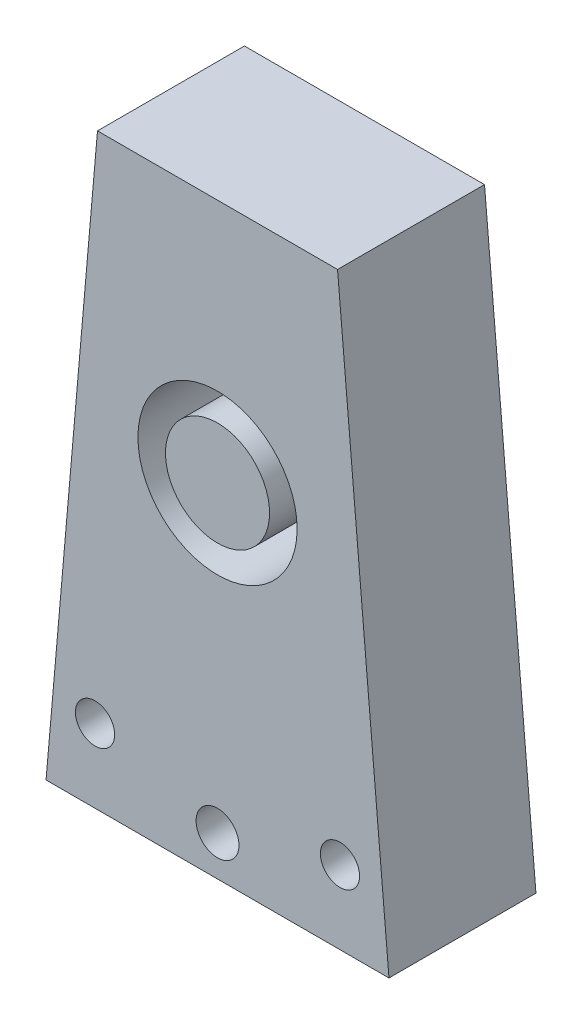
ISO-10303-21;
HEADER;
FILE_DESCRIPTION(('STEP AP214'),'2;1');
FILE_NAME('part.step','',(''),(''),'','','');
FILE_SCHEMA(('AUTOMOTIVE_DESIGN { 1 0 10303 214 1 1 1 1 }'));
ENDSEC;
DATA;
#1=APPLICATION_CONTEXT('core data for automotive mechanical design processes');
#2=APPLICATION_PROTOCOL_DEFINITION('international standard','automotive_design',2000,#1);
#3=PRODUCT_CONTEXT('',#1,'mechanical');
#4=PRODUCT('Part','Part','',(#3));
#5=PRODUCT_RELATED_PRODUCT_CATEGORY('part','',(#4));
#6=PRODUCT_DEFINITION_FORMATION('','',#4);
#7=PRODUCT_DEFINITION_CONTEXT('part definition',#1,'design');
#8=PRODUCT_DEFINITION('design','',#6,#7);
#9=PRODUCT_DEFINITION_SHAPE('','',#8);
#10=(LENGTH_UNIT() NAMED_UNIT(*) SI_UNIT(.MILLI.,.METRE.));
#11=(NAMED_UNIT(*) PLANE_ANGLE_UNIT() SI_UNIT($,.RADIAN.));
#12=(NAMED_UNIT(*) SI_UNIT($,.STERADIAN.) SOLID_ANGLE_UNIT());
#13=UNCERTAINTY_MEASURE_WITH_UNIT(LENGTH_MEASURE(1.E-05),#10,'distance_accuracy_value','');
#14=(GEOMETRIC_REPRESENTATION_CONTEXT(3) GLOBAL_UNCERTAINTY_ASSIGNED_CONTEXT((#13)) GLOBAL_UNIT_ASSIGNED_CONTEXT((#10,
#11,#12)) REPRESENTATION_CONTEXT('',''));
#15=CARTESIAN_POINT('',(0.,0.,0.));
#16=DIRECTION('',(0.,0.,1.));
#17=DIRECTION('',(1.,0.,0.));
#18=AXIS2_PLACEMENT_3D('',#15,#16,#17);
#19=CARTESIAN_POINT('',(-9.8,48.,12.));
#20=DIRECTION('',(0.996193717496113,-0.0871669502809099,0.));
#21=DIRECTION('',(0.0871669502809099,0.996193717496113,0.));
#22=AXIS2_PLACEMENT_3D('',#19,#20,#21);
#23=PLANE('',#22);
#24=DIRECTION('',(-0.0871669502809099,-0.996193717496113,0.));
#25=VECTOR('',#24,1.);
#26=CARTESIAN_POINT('',(-9.8,48.,0.));
#27=LINE('',#26,#25);
#28=CARTESIAN_POINT('',(-9.8,48.,0.));
#29=VERTEX_POINT('',#28);
#30=CARTESIAN_POINT('',(-14.,0.,0.));
#31=VERTEX_POINT('',#30);
#32=EDGE_CURVE('E130',#29,#31,#27,.T.);
#33=ORIENTED_EDGE('',*,*,#32,.T.);
#34=DIRECTION('',(0.,0.,-1.));
#35=VECTOR('',#34,1.);
#36=CARTESIAN_POINT('',(-14.,0.,12.));
#37=LINE('',#36,#35);
#38=CARTESIAN_POINT('',(-14.,0.,12.));
#39=VERTEX_POINT('',#38);
#40=EDGE_CURVE('E109',#39,#31,#37,.T.);
#41=ORIENTED_EDGE('',*,*,#40,.F.);
#42=DIRECTION('',(-0.0871669502809099,-0.996193717496113,0.));
#43=VECTOR('',#42,1.);
#44=CARTESIAN_POINT('',(-9.8,48.,12.));
#45=LINE('',#44,#43);
#46=CARTESIAN_POINT('',(-9.8,48.,12.));
#47=VERTEX_POINT('',#46);
#48=EDGE_CURVE('E136',#47,#39,#45,.T.);
#49=ORIENTED_EDGE('',*,*,#48,.F.);
#50=DIRECTION('',(0.,0.,-1.));
#51=VECTOR('',#50,1.);
#52=CARTESIAN_POINT('',(-9.8,48.,12.));
#53=LINE('',#52,#51);
#54=EDGE_CURVE('E114',#47,#29,#53,.T.);
#55=ORIENTED_EDGE('',*,*,#54,.T.);
#56=EDGE_LOOP('',(#33,#41,#49,#55));
#57=FACE_BOUND('',#56,.T.);
#58=ADVANCED_FACE('F52',(#57),#23,.F.);
#59=CARTESIAN_POINT('',(-14.,0.,12.));
#60=DIRECTION('',(0.,1.,0.));
#61=DIRECTION('',(0.,0.,1.));
#62=AXIS2_PLACEMENT_3D('',#59,#60,#61);
#63=PLANE('',#62);
#64=DIRECTION('',(1.,0.,0.));
#65=VECTOR('',#64,1.);
#66=CARTESIAN_POINT('',(-14.,0.,0.));
#67=LINE('',#66,#65);
#68=CARTESIAN_POINT('',(14.,0.,0.));
#69=VERTEX_POINT('',#68);
#70=EDGE_CURVE('E71',#31,#69,#67,.T.);
#71=ORIENTED_EDGE('',*,*,#70,.T.);
#72=DIRECTION('',(0.,0.,-1.));
#73=VECTOR('',#72,1.);
#74=CARTESIAN_POINT('',(14.,0.,12.));
#75=LINE('',#74,#73);
#76=CARTESIAN_POINT('',(14.,0.,12.));
#77=VERTEX_POINT('',#76);
#78=EDGE_CURVE('E110',#77,#69,#75,.T.);
#79=ORIENTED_EDGE('',*,*,#78,.F.);
#80=DIRECTION('',(1.,0.,0.));
#81=VECTOR('',#80,1.);
#82=CARTESIAN_POINT('',(-14.,0.,12.));
#83=LINE('',#82,#81);
#84=EDGE_CURVE('E90',#39,#77,#83,.T.);
#85=ORIENTED_EDGE('',*,*,#84,.F.);
#86=ORIENTED_EDGE('',*,*,#40,.T.);
#87=EDGE_LOOP('',(#71,#79,#85,#86));
#88=FACE_BOUND('',#87,.T.);
#89=ADVANCED_FACE('F106',(#88),#63,.F.);
#90=CARTESIAN_POINT('',(14.,0.,12.));
#91=DIRECTION('',(-0.996193717496113,-0.0871669502809099,0.));
#92=DIRECTION('',(0.0871669502809099,-0.996193717496113,0.));
#93=AXIS2_PLACEMENT_3D('',#90,#91,#92);
#94=PLANE('',#93);
#95=DIRECTION('',(-0.0871669502809099,0.996193717496113,0.));
#96=VECTOR('',#95,1.);
#97=CARTESIAN_POINT('',(14.,0.,0.));
#98=LINE('',#97,#96);
#99=CARTESIAN_POINT('',(9.8,48.,0.));
#100=VERTEX_POINT('',#99);
#101=EDGE_CURVE('E102',#69,#100,#98,.T.);
#102=ORIENTED_EDGE('',*,*,#101,.T.);
#103=DIRECTION('',(0.,0.,-1.));
#104=VECTOR('',#103,1.);
#105=CARTESIAN_POINT('',(9.8,48.,12.));
#106=LINE('',#105,#104);
#107=CARTESIAN_POINT('',(9.8,48.,12.));
#108=VERTEX_POINT('',#107);
#109=EDGE_CURVE('E148',#108,#100,#106,.T.);
#110=ORIENTED_EDGE('',*,*,#109,.F.);
#111=DIRECTION('',(-0.0871669502809099,0.996193717496113,0.));
#112=VECTOR('',#111,1.);
#113=CARTESIAN_POINT('',(14.,0.,12.));
#114=LINE('',#113,#112);
#115=EDGE_CURVE('E117',#77,#108,#114,.T.);
#116=ORIENTED_EDGE('',*,*,#115,.F.);
#117=ORIENTED_EDGE('',*,*,#78,.T.);
#118=EDGE_LOOP('',(#102,#110,#116,#117));
#119=FACE_BOUND('',#118,.T.);
#120=ADVANCED_FACE('F113',(#119),#94,.F.);
#121=CARTESIAN_POINT('',(9.8,48.,12.));
#122=DIRECTION('',(0.,-1.,0.));
#123=DIRECTION('',(0.,0.,-1.));
#124=AXIS2_PLACEMENT_3D('',#121,#122,#123);
#125=PLANE('',#124);
#126=DIRECTION('',(-1.,0.,0.));
#127=VECTOR('',#126,1.);
#128=CARTESIAN_POINT('',(9.8,48.,0.));
#129=LINE('',#128,#127);
#130=EDGE_CURVE('E98',#100,#29,#129,.T.);
#131=ORIENTED_EDGE('',*,*,#130,.T.);
#132=ORIENTED_EDGE('',*,*,#54,.F.);
#133=DIRECTION('',(-1.,0.,0.));
#134=VECTOR('',#133,1.);
#135=CARTESIAN_POINT('',(9.8,48.,12.));
#136=LINE('',#135,#134);
#137=EDGE_CURVE('E128',#108,#47,#136,.T.);
#138=ORIENTED_EDGE('',*,*,#137,.F.);
#139=ORIENTED_EDGE('',*,*,#109,.T.);
#140=EDGE_LOOP('',(#131,#132,#138,#139));
#141=FACE_BOUND('',#140,.T.);
#142=ADVANCED_FACE('F195',(#141),#125,.F.);
#143=CARTESIAN_POINT('',(0.,0.,12.));
#144=DIRECTION('',(0.,0.,1.));
#145=DIRECTION('',(1.,0.,0.));
#146=AXIS2_PLACEMENT_3D('',#143,#144,#145);
#147=PLANE('',#146);
#148=CARTESIAN_POINT('',(10.,6.,12.));
#149=DIRECTION('',(0.,0.,1.));
#150=DIRECTION('',(1.,0.,0.));
#151=AXIS2_PLACEMENT_3D('',#148,#149,#150);
#152=CIRCLE('',#151,1.6);
#153=CARTESIAN_POINT('',(11.6,6.,12.));
#154=VERTEX_POINT('',#153);
#155=EDGE_CURVE('E143',#154,#154,#152,.F.);
#156=ORIENTED_EDGE('',*,*,#155,.T.);
#157=EDGE_LOOP('',(#156));
#158=FACE_BOUND('',#157,.T.);
#159=CARTESIAN_POINT('',(0.,28.,12.));
#160=DIRECTION('',(0.,0.,1.));
#161=DIRECTION('',(1.,0.,0.));
#162=AXIS2_PLACEMENT_3D('',#159,#160,#161);
#163=CIRCLE('',#162,6.5);
#164=CARTESIAN_POINT('',(6.5,28.,12.));
#165=VERTEX_POINT('',#164);
#166=EDGE_CURVE('E144',#165,#165,#163,.F.);
#167=ORIENTED_EDGE('',*,*,#166,.T.);
#168=EDGE_LOOP('',(#167));
#169=FACE_BOUND('',#168,.T.);
#170=CARTESIAN_POINT('',(0.,3.25,12.));
#171=DIRECTION('',(0.,0.,1.));
#172=DIRECTION('',(1.,0.,0.));
#173=AXIS2_PLACEMENT_3D('',#170,#171,#172);
#174=CIRCLE('',#173,1.75);
#175=CARTESIAN_POINT('',(1.75,3.25,12.));
#176=VERTEX_POINT('',#175);
#177=EDGE_CURVE('E147',#176,#176,#174,.F.);
#178=ORIENTED_EDGE('',*,*,#177,.T.);
#179=EDGE_LOOP('',(#178));
#180=FACE_BOUND('',#179,.T.);
#181=CARTESIAN_POINT('',(-10.,6.,12.));
#182=DIRECTION('',(0.,0.,1.));
#183=DIRECTION('',(1.,0.,0.));
#184=AXIS2_PLACEMENT_3D('',#181,#182,#183);
#185=CIRCLE('',#184,1.6);
#186=CARTESIAN_POINT('',(-8.4,6.,12.));
#187=VERTEX_POINT('',#186);
#188=EDGE_CURVE('E137',#187,#187,#185,.F.);
#189=ORIENTED_EDGE('',*,*,#188,.T.);
#190=EDGE_LOOP('',(#189));
#191=FACE_BOUND('',#190,.T.);
#192=ORIENTED_EDGE('',*,*,#48,.T.);
#193=ORIENTED_EDGE('',*,*,#84,.T.);
#194=ORIENTED_EDGE('',*,*,#115,.T.);
#195=ORIENTED_EDGE('',*,*,#137,.T.);
#196=EDGE_LOOP('',(#192,#193,#194,#195));
#197=FACE_BOUND('',#196,.T.);
#198=ADVANCED_FACE('F54',(#158,#169,#180,#191,#197),#147,.T.);
#199=CARTESIAN_POINT('',(0.,0.,0.));
#200=DIRECTION('',(0.,0.,1.));
#201=DIRECTION('',(1.,0.,0.));
#202=AXIS2_PLACEMENT_3D('',#199,#200,#201);
#203=PLANE('',#202);
#204=CARTESIAN_POINT('',(10.,6.,0.));
#205=DIRECTION('',(0.,0.,1.));
#206=DIRECTION('',(1.,0.,0.));
#207=AXIS2_PLACEMENT_3D('',#204,#205,#206);
#208=CIRCLE('',#207,1.6);
#209=CARTESIAN_POINT('',(11.6,6.,0.));
#210=VERTEX_POINT('',#209);
#211=EDGE_CURVE('E60',#210,#210,#208,.T.);
#212=ORIENTED_EDGE('',*,*,#211,.T.);
#213=EDGE_LOOP('',(#212));
#214=FACE_BOUND('',#213,.T.);
#215=CARTESIAN_POINT('',(0.,28.,0.));
#216=DIRECTION('',(0.,0.,1.));
#217=DIRECTION('',(1.,0.,0.));
#218=AXIS2_PLACEMENT_3D('',#215,#216,#217);
#219=CIRCLE('',#218,6.5);
#220=CARTESIAN_POINT('',(6.5,28.,0.));
#221=VERTEX_POINT('',#220);
#222=EDGE_CURVE('E160',#221,#221,#219,.T.);
#223=ORIENTED_EDGE('',*,*,#222,.T.);
#224=EDGE_LOOP('',(#223));
#225=FACE_BOUND('',#224,.T.);
#226=CARTESIAN_POINT('',(0.,3.25,0.));
#227=DIRECTION('',(0.,0.,1.));
#228=DIRECTION('',(1.,0.,0.));
#229=AXIS2_PLACEMENT_3D('',#226,#227,#228);
#230=CIRCLE('',#229,1.75);
#231=CARTESIAN_POINT('',(1.75,3.25,0.));
#232=VERTEX_POINT('',#231);
#233=EDGE_CURVE('E61',#232,#232,#230,.T.);
#234=ORIENTED_EDGE('',*,*,#233,.T.);
#235=EDGE_LOOP('',(#234));
#236=FACE_BOUND('',#235,.T.);
#237=CARTESIAN_POINT('',(-10.,6.,0.));
#238=DIRECTION('',(0.,0.,1.));
#239=DIRECTION('',(1.,0.,0.));
#240=AXIS2_PLACEMENT_3D('',#237,#238,#239);
#241=CIRCLE('',#240,1.6);
#242=CARTESIAN_POINT('',(-8.4,6.,0.));
#243=VERTEX_POINT('',#242);
#244=EDGE_CURVE('E12',#243,#243,#241,.T.);
#245=ORIENTED_EDGE('',*,*,#244,.T.);
#246=EDGE_LOOP('',(#245));
#247=FACE_BOUND('',#246,.T.);
#248=ORIENTED_EDGE('',*,*,#32,.F.);
#249=ORIENTED_EDGE('',*,*,#130,.F.);
#250=ORIENTED_EDGE('',*,*,#101,.F.);
#251=ORIENTED_EDGE('',*,*,#70,.F.);
#252=EDGE_LOOP('',(#248,#249,#250,#251));
#253=FACE_BOUND('',#252,.T.);
#254=ADVANCED_FACE('F116',(#214,#225,#236,#247,#253),#203,.F.);
#255=CARTESIAN_POINT('',(-10.,6.,13.));
#256=DIRECTION('',(0.,0.,-1.));
#257=DIRECTION('',(-1.,0.,0.));
#258=AXIS2_PLACEMENT_3D('',#255,#256,#257);
#259=CYLINDRICAL_SURFACE('',#258,1.6);
#260=ORIENTED_EDGE('',*,*,#188,.F.);
#261=EDGE_LOOP('',(#260));
#262=FACE_BOUND('',#261,.T.);
#263=ORIENTED_EDGE('',*,*,#244,.F.);
#264=EDGE_LOOP('',(#263));
#265=FACE_BOUND('',#264,.T.);
#266=ADVANCED_FACE('F166',(#262,#265),#259,.F.);
#267=CARTESIAN_POINT('',(0.,3.25,13.));
#268=DIRECTION('',(0.,0.,-1.));
#269=DIRECTION('',(-1.,0.,0.));
#270=AXIS2_PLACEMENT_3D('',#267,#268,#269);
#271=CYLINDRICAL_SURFACE('',#270,1.75);
#272=ORIENTED_EDGE('',*,*,#177,.F.);
#273=EDGE_LOOP('',(#272));
#274=FACE_BOUND('',#273,.T.);
#275=ORIENTED_EDGE('',*,*,#233,.F.);
#276=EDGE_LOOP('',(#275));
#277=FACE_BOUND('',#276,.T.);
#278=ADVANCED_FACE('F167',(#274,#277),#271,.F.);
#279=CARTESIAN_POINT('',(0.,28.,13.));
#280=DIRECTION('',(0.,0.,-1.));
#281=DIRECTION('',(-1.,0.,0.));
#282=AXIS2_PLACEMENT_3D('',#279,#280,#281);
#283=CYLINDRICAL_SURFACE('',#282,6.5);
#284=ORIENTED_EDGE('',*,*,#166,.F.);
#285=EDGE_LOOP('',(#284));
#286=FACE_BOUND('',#285,.T.);
#287=ORIENTED_EDGE('',*,*,#222,.F.);
#288=EDGE_LOOP('',(#287));
#289=FACE_BOUND('',#288,.T.);
#290=ADVANCED_FACE('F169',(#286,#289),#283,.F.);
#291=CARTESIAN_POINT('',(10.,6.,13.));
#292=DIRECTION('',(0.,0.,-1.));
#293=DIRECTION('',(-1.,0.,0.));
#294=AXIS2_PLACEMENT_3D('',#291,#292,#293);
#295=CYLINDRICAL_SURFACE('',#294,1.6);
#296=ORIENTED_EDGE('',*,*,#155,.F.);
#297=EDGE_LOOP('',(#296));
#298=FACE_BOUND('',#297,.T.);
#299=ORIENTED_EDGE('',*,*,#211,.F.);
#300=EDGE_LOOP('',(#299));
#301=FACE_BOUND('',#300,.T.);
#302=ADVANCED_FACE('F179',(#298,#301),#295,.F.);
#303=CLOSED_SHELL('',(#58,#89,#120,#142,#198,#254,#266,#278,#290,#302));
#304=MANIFOLD_SOLID_BREP('B2',#303);
#305=CARTESIAN_POINT('',(0.,0.,0.));
#306=DIRECTION('',(0.,0.,1.));
#307=DIRECTION('',(1.,0.,0.));
#308=AXIS2_PLACEMENT_3D('',#305,#306,#307);
#309=PLANE('',#308);
#310=CARTESIAN_POINT('',(0.,28.,0.));
#311=DIRECTION('',(0.,0.,1.));
#312=DIRECTION('',(1.,0.,0.));
#313=AXIS2_PLACEMENT_3D('',#310,#311,#312);
#314=CIRCLE('',#313,4.25);
#315=CARTESIAN_POINT('',(4.25,28.,0.));
#316=VERTEX_POINT('',#315);
#317=EDGE_CURVE('E286',#316,#316,#314,.T.);
#318=ORIENTED_EDGE('',*,*,#317,.F.);
#319=EDGE_LOOP('',(#318));
#320=FACE_BOUND('',#319,.T.);
#321=ADVANCED_FACE('F282',(#320),#309,.F.);
#322=CARTESIAN_POINT('',(0.,28.,13.));
#323=DIRECTION('',(0.,0.,-1.));
#324=DIRECTION('',(-1.,0.,0.));
#325=AXIS2_PLACEMENT_3D('',#322,#323,#324);
#326=CYLINDRICAL_SURFACE('',#325,4.25);
#327=CARTESIAN_POINT('',(0.,28.,12.));
#328=DIRECTION('',(0.,0.,1.));
#329=DIRECTION('',(1.,0.,0.));
#330=AXIS2_PLACEMENT_3D('',#327,#328,#329);
#331=CIRCLE('',#330,4.25);
#332=CARTESIAN_POINT('',(4.25,28.,12.));
#333=VERTEX_POINT('',#332);
#334=EDGE_CURVE('E55',#333,#333,#331,.F.);
#335=ORIENTED_EDGE('',*,*,#334,.T.);
#336=EDGE_LOOP('',(#335));
#337=FACE_BOUND('',#336,.T.);
#338=ORIENTED_EDGE('',*,*,#317,.T.);
#339=EDGE_LOOP('',(#338));
#340=FACE_BOUND('',#339,.T.);
#341=ADVANCED_FACE('F291',(#337,#340),#326,.T.);
#342=CARTESIAN_POINT('',(0.,0.,12.));
#343=DIRECTION('',(0.,0.,1.));
#344=DIRECTION('',(1.,0.,0.));
#345=AXIS2_PLACEMENT_3D('',#342,#343,#344);
#346=PLANE('',#345);
#347=ORIENTED_EDGE('',*,*,#334,.F.);
#348=EDGE_LOOP('',(#347));
#349=FACE_BOUND('',#348,.T.);
#350=ADVANCED_FACE('F296',(#349),#346,.T.);
#351=CLOSED_SHELL('',(#321,#341,#350));
#352=MANIFOLD_SOLID_BREP('B6',#351);
#353=ADVANCED_BREP_SHAPE_REPRESENTATION('',(#18,#304,#352),#14);
#354=SHAPE_DEFINITION_REPRESENTATION(#9,#353);
ENDSEC;
END-ISO-10303-21;
